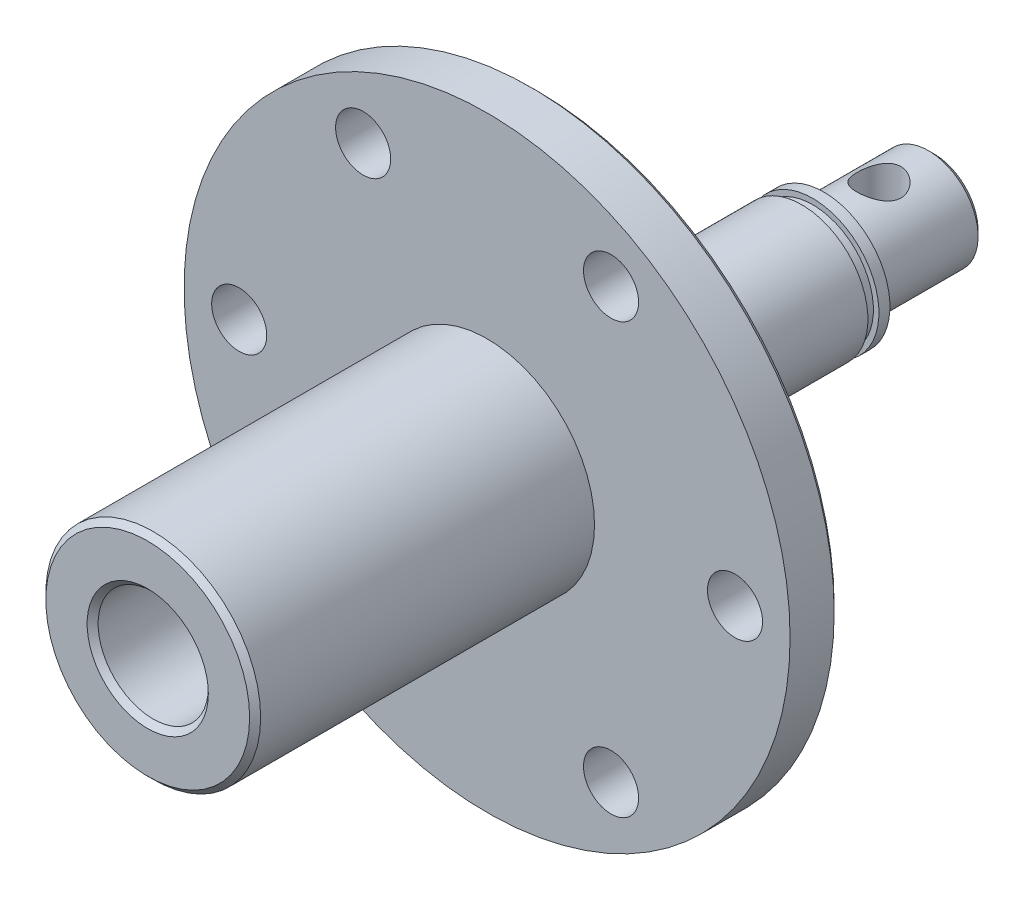
ISO-10303-21;
HEADER;
FILE_DESCRIPTION(('STEP AP214'),'2;1');
FILE_NAME('part.step','',(''),(''),'','','');
FILE_SCHEMA(('AUTOMOTIVE_DESIGN { 1 0 10303 214 1 1 1 1 }'));
ENDSEC;
DATA;
#1=APPLICATION_CONTEXT('core data for automotive mechanical design processes');
#2=APPLICATION_PROTOCOL_DEFINITION('international standard','automotive_design',2000,#1);
#3=PRODUCT_CONTEXT('',#1,'mechanical');
#4=PRODUCT('Part','Part','',(#3));
#5=PRODUCT_RELATED_PRODUCT_CATEGORY('part','',(#4));
#6=PRODUCT_DEFINITION_FORMATION('','',#4);
#7=PRODUCT_DEFINITION_CONTEXT('part definition',#1,'design');
#8=PRODUCT_DEFINITION('design','',#6,#7);
#9=PRODUCT_DEFINITION_SHAPE('','',#8);
#10=(LENGTH_UNIT() NAMED_UNIT(*) SI_UNIT(.MILLI.,.METRE.));
#11=(NAMED_UNIT(*) PLANE_ANGLE_UNIT() SI_UNIT($,.RADIAN.));
#12=(NAMED_UNIT(*) SI_UNIT($,.STERADIAN.) SOLID_ANGLE_UNIT());
#13=UNCERTAINTY_MEASURE_WITH_UNIT(LENGTH_MEASURE(1.E-05),#10,'distance_accuracy_value','');
#14=(GEOMETRIC_REPRESENTATION_CONTEXT(3) GLOBAL_UNCERTAINTY_ASSIGNED_CONTEXT((#13)) GLOBAL_UNIT_ASSIGNED_CONTEXT((#10,
#11,#12)) REPRESENTATION_CONTEXT('',''));
#15=CARTESIAN_POINT('',(0.,0.,0.));
#16=DIRECTION('',(0.,0.,1.));
#17=DIRECTION('',(1.,0.,0.));
#18=AXIS2_PLACEMENT_3D('',#15,#16,#17);
#19=CARTESIAN_POINT('',(0.,0.,3.));
#20=DIRECTION('',(0.,0.,1.));
#21=DIRECTION('',(1.,0.,0.));
#22=AXIS2_PLACEMENT_3D('',#19,#20,#21);
#23=PLANE('',#22);
#24=CARTESIAN_POINT('',(-22.5,0.,3.));
#25=DIRECTION('',(0.,0.,1.));
#26=DIRECTION('',(1.,0.,0.));
#27=AXIS2_PLACEMENT_3D('',#24,#25,#26);
#28=CIRCLE('',#27,2.49999999999998);
#29=CARTESIAN_POINT('',(-20.,0.,3.));
#30=VERTEX_POINT('',#29);
#31=EDGE_CURVE('E612',#30,#30,#28,.T.);
#32=ORIENTED_EDGE('',*,*,#31,.F.);
#33=EDGE_LOOP('',(#32));
#34=FACE_BOUND('',#33,.T.);
#35=CARTESIAN_POINT('',(-11.25,19.48557158515,3.));
#36=DIRECTION('',(0.,0.,1.));
#37=DIRECTION('',(1.,0.,0.));
#38=AXIS2_PLACEMENT_3D('',#35,#36,#37);
#39=CIRCLE('',#38,2.49999999999998);
#40=CARTESIAN_POINT('',(-8.75000000000001,19.48557158515,3.));
#41=VERTEX_POINT('',#40);
#42=EDGE_CURVE('E606',#41,#41,#39,.T.);
#43=ORIENTED_EDGE('',*,*,#42,.F.);
#44=EDGE_LOOP('',(#43));
#45=FACE_BOUND('',#44,.T.);
#46=CARTESIAN_POINT('',(11.25,19.48557158515,3.));
#47=DIRECTION('',(0.,0.,1.));
#48=DIRECTION('',(1.,0.,0.));
#49=AXIS2_PLACEMENT_3D('',#46,#47,#48);
#50=CIRCLE('',#49,2.49999999999998);
#51=CARTESIAN_POINT('',(13.75,19.48557158515,3.));
#52=VERTEX_POINT('',#51);
#53=EDGE_CURVE('E600',#52,#52,#50,.T.);
#54=ORIENTED_EDGE('',*,*,#53,.F.);
#55=EDGE_LOOP('',(#54));
#56=FACE_BOUND('',#55,.T.);
#57=CARTESIAN_POINT('',(22.5,0.,3.));
#58=DIRECTION('',(0.,0.,1.));
#59=DIRECTION('',(1.,0.,0.));
#60=AXIS2_PLACEMENT_3D('',#57,#58,#59);
#61=CIRCLE('',#60,2.49999999999998);
#62=CARTESIAN_POINT('',(25.,0.,3.));
#63=VERTEX_POINT('',#62);
#64=EDGE_CURVE('E594',#63,#63,#61,.T.);
#65=ORIENTED_EDGE('',*,*,#64,.F.);
#66=EDGE_LOOP('',(#65));
#67=FACE_BOUND('',#66,.T.);
#68=CARTESIAN_POINT('',(11.25,-19.48557158515,3.));
#69=DIRECTION('',(0.,0.,1.));
#70=DIRECTION('',(1.,0.,0.));
#71=AXIS2_PLACEMENT_3D('',#68,#69,#70);
#72=CIRCLE('',#71,2.49999999999998);
#73=CARTESIAN_POINT('',(13.75,-19.48557158515,3.));
#74=VERTEX_POINT('',#73);
#75=EDGE_CURVE('E588',#74,#74,#72,.T.);
#76=ORIENTED_EDGE('',*,*,#75,.F.);
#77=EDGE_LOOP('',(#76));
#78=FACE_BOUND('',#77,.T.);
#79=CARTESIAN_POINT('',(-11.25,-19.48557158515,3.));
#80=DIRECTION('',(0.,0.,1.));
#81=DIRECTION('',(1.,0.,0.));
#82=AXIS2_PLACEMENT_3D('',#79,#80,#81);
#83=CIRCLE('',#82,2.49999999999998);
#84=CARTESIAN_POINT('',(-8.75000000000001,-19.48557158515,3.));
#85=VERTEX_POINT('',#84);
#86=EDGE_CURVE('E229',#85,#85,#83,.T.);
#87=ORIENTED_EDGE('',*,*,#86,.F.);
#88=EDGE_LOOP('',(#87));
#89=FACE_BOUND('',#88,.T.);
#90=CARTESIAN_POINT('',(0.,0.,3.));
#91=DIRECTION('',(0.,0.,1.));
#92=DIRECTION('',(1.,0.,0.));
#93=AXIS2_PLACEMENT_3D('',#90,#91,#92);
#94=CIRCLE('',#93,27.5);
#95=CARTESIAN_POINT('',(27.5,0.,3.));
#96=VERTEX_POINT('',#95);
#97=EDGE_CURVE('E85',#96,#96,#94,.T.);
#98=ORIENTED_EDGE('',*,*,#97,.T.);
#99=EDGE_LOOP('',(#98));
#100=FACE_BOUND('',#99,.T.);
#101=CARTESIAN_POINT('',(0.,0.,3.));
#102=DIRECTION('',(0.,0.,1.));
#103=DIRECTION('',(1.,0.,0.));
#104=AXIS2_PLACEMENT_3D('',#101,#102,#103);
#105=CIRCLE('',#104,9.75);
#106=CARTESIAN_POINT('',(9.75,0.,3.));
#107=VERTEX_POINT('',#106);
#108=EDGE_CURVE('E223',#107,#107,#105,.T.);
#109=ORIENTED_EDGE('',*,*,#108,.F.);
#110=EDGE_LOOP('',(#109));
#111=FACE_BOUND('',#110,.T.);
#112=ADVANCED_FACE('F40',(#34,#45,#56,#67,#78,#89,#100,#111),#23,.T.);
#113=CARTESIAN_POINT('',(0.,0.,-27.56));
#114=DIRECTION('',(0.,0.,-1.));
#115=DIRECTION('',(-1.,0.,0.));
#116=AXIS2_PLACEMENT_3D('',#113,#114,#115);
#117=PLANE('',#116);
#118=CARTESIAN_POINT('',(0.,0.,-27.56));
#119=DIRECTION('',(0.,0.,-1.));
#120=DIRECTION('',(-1.,0.,0.));
#121=AXIS2_PLACEMENT_3D('',#118,#119,#120);
#122=CIRCLE('',#121,6.);
#123=CARTESIAN_POINT('',(-6.,0.,-27.56));
#124=VERTEX_POINT('',#123);
#125=EDGE_CURVE('E222',#124,#124,#122,.F.);
#126=ORIENTED_EDGE('',*,*,#125,.F.);
#127=EDGE_LOOP('',(#126));
#128=FACE_BOUND('',#127,.T.);
#129=CARTESIAN_POINT('',(0.,0.,-27.56));
#130=DIRECTION('',(0.,0.,-1.));
#131=DIRECTION('',(-1.,0.,0.));
#132=AXIS2_PLACEMENT_3D('',#129,#130,#131);
#133=CIRCLE('',#132,4.5);
#134=CARTESIAN_POINT('',(-4.5,0.,-27.56));
#135=VERTEX_POINT('',#134);
#136=EDGE_CURVE('E220',#135,#135,#133,.T.);
#137=ORIENTED_EDGE('',*,*,#136,.F.);
#138=EDGE_LOOP('',(#137));
#139=FACE_BOUND('',#138,.T.);
#140=ADVANCED_FACE('F150',(#128,#139),#117,.T.);
#141=CARTESIAN_POINT('',(0.,0.,-26.56));
#142=DIRECTION('',(0.,0.,-1.));
#143=DIRECTION('',(-1.,0.,0.));
#144=AXIS2_PLACEMENT_3D('',#141,#142,#143);
#145=CYLINDRICAL_SURFACE('',#144,6.);
#146=ORIENTED_EDGE('',*,*,#125,.T.);
#147=EDGE_LOOP('',(#146));
#148=FACE_BOUND('',#147,.T.);
#149=CARTESIAN_POINT('',(0.,0.,-26.56));
#150=DIRECTION('',(0.,0.,-1.));
#151=DIRECTION('',(-1.,0.,0.));
#152=AXIS2_PLACEMENT_3D('',#149,#150,#151);
#153=CIRCLE('',#152,6.);
#154=CARTESIAN_POINT('',(-6.,0.,-26.56));
#155=VERTEX_POINT('',#154);
#156=EDGE_CURVE('E227',#155,#155,#153,.T.);
#157=ORIENTED_EDGE('',*,*,#156,.T.);
#158=EDGE_LOOP('',(#157));
#159=FACE_BOUND('',#158,.T.);
#160=ADVANCED_FACE('F148',(#148,#159),#145,.T.);
#161=CARTESIAN_POINT('',(0.,0.,-26.56));
#162=DIRECTION('',(0.,0.,-1.));
#163=DIRECTION('',(-1.,0.,0.));
#164=AXIS2_PLACEMENT_3D('',#161,#162,#163);
#165=PLANE('',#164);
#166=CARTESIAN_POINT('',(0.,0.,-26.56));
#167=DIRECTION('',(0.,0.,-1.));
#168=DIRECTION('',(-1.,0.,0.));
#169=AXIS2_PLACEMENT_3D('',#166,#167,#168);
#170=CIRCLE('',#169,5.5);
#171=CARTESIAN_POINT('',(-5.5,0.,-26.56));
#172=VERTEX_POINT('',#171);
#173=EDGE_CURVE('E261',#172,#172,#170,.F.);
#174=ORIENTED_EDGE('',*,*,#173,.F.);
#175=EDGE_LOOP('',(#174));
#176=FACE_BOUND('',#175,.T.);
#177=ORIENTED_EDGE('',*,*,#156,.F.);
#178=EDGE_LOOP('',(#177));
#179=FACE_BOUND('',#178,.T.);
#180=ADVANCED_FACE('F184',(#176,#179),#165,.F.);
#181=CARTESIAN_POINT('',(0.,0.,-25.56));
#182=DIRECTION('',(0.,0.,-1.));
#183=DIRECTION('',(-1.,0.,0.));
#184=AXIS2_PLACEMENT_3D('',#181,#182,#183);
#185=CYLINDRICAL_SURFACE('',#184,5.5);
#186=CARTESIAN_POINT('',(0.,0.,-25.56));
#187=DIRECTION('',(0.,0.,-1.));
#188=DIRECTION('',(-1.,0.,0.));
#189=AXIS2_PLACEMENT_3D('',#186,#187,#188);
#190=CIRCLE('',#189,5.5);
#191=CARTESIAN_POINT('',(-5.5,0.,-25.56));
#192=VERTEX_POINT('',#191);
#193=EDGE_CURVE('E325',#192,#192,#190,.F.);
#194=ORIENTED_EDGE('',*,*,#193,.F.);
#195=EDGE_LOOP('',(#194));
#196=FACE_BOUND('',#195,.T.);
#197=ORIENTED_EDGE('',*,*,#173,.T.);
#198=EDGE_LOOP('',(#197));
#199=FACE_BOUND('',#198,.T.);
#200=ADVANCED_FACE('F180',(#196,#199),#185,.T.);
#201=CARTESIAN_POINT('',(0.,0.,-25.56));
#202=DIRECTION('',(0.,0.,-1.));
#203=DIRECTION('',(-1.,0.,0.));
#204=AXIS2_PLACEMENT_3D('',#201,#202,#203);
#205=PLANE('',#204);
#206=ORIENTED_EDGE('',*,*,#193,.T.);
#207=EDGE_LOOP('',(#206));
#208=FACE_BOUND('',#207,.T.);
#209=CARTESIAN_POINT('',(0.,0.,-25.56));
#210=DIRECTION('',(0.,0.,-1.));
#211=DIRECTION('',(-1.,0.,0.));
#212=AXIS2_PLACEMENT_3D('',#209,#210,#211);
#213=CIRCLE('',#212,6.);
#214=CARTESIAN_POINT('',(-6.,0.,-25.56));
#215=VERTEX_POINT('',#214);
#216=EDGE_CURVE('E329',#215,#215,#213,.F.);
#217=ORIENTED_EDGE('',*,*,#216,.F.);
#218=EDGE_LOOP('',(#217));
#219=FACE_BOUND('',#218,.T.);
#220=ADVANCED_FACE('F176',(#208,#219),#205,.T.);
#221=CARTESIAN_POINT('',(0.,0.,-14.56));
#222=DIRECTION('',(0.,0.,-1.));
#223=DIRECTION('',(-1.,0.,0.));
#224=AXIS2_PLACEMENT_3D('',#221,#222,#223);
#225=CYLINDRICAL_SURFACE('',#224,6.);
#226=ORIENTED_EDGE('',*,*,#216,.T.);
#227=EDGE_LOOP('',(#226));
#228=FACE_BOUND('',#227,.T.);
#229=CARTESIAN_POINT('',(0.,0.,-14.56));
#230=DIRECTION('',(0.,0.,-1.));
#231=DIRECTION('',(-1.,0.,0.));
#232=AXIS2_PLACEMENT_3D('',#229,#230,#231);
#233=CIRCLE('',#232,6.);
#234=CARTESIAN_POINT('',(-6.,0.,-14.56));
#235=VERTEX_POINT('',#234);
#236=EDGE_CURVE('E332',#235,#235,#233,.F.);
#237=ORIENTED_EDGE('',*,*,#236,.F.);
#238=EDGE_LOOP('',(#237));
#239=FACE_BOUND('',#238,.T.);
#240=ADVANCED_FACE('F172',(#228,#239),#225,.T.);
#241=CARTESIAN_POINT('',(0.,0.,-14.56));
#242=DIRECTION('',(0.,0.,-1.));
#243=DIRECTION('',(-1.,0.,0.));
#244=AXIS2_PLACEMENT_3D('',#241,#242,#243);
#245=PLANE('',#244);
#246=CARTESIAN_POINT('',(0.,0.,-14.56));
#247=DIRECTION('',(0.,0.,-1.));
#248=DIRECTION('',(-1.,0.,0.));
#249=AXIS2_PLACEMENT_3D('',#246,#247,#248);
#250=CIRCLE('',#249,8.49992750991391);
#251=CARTESIAN_POINT('',(-8.49992750991391,0.,-14.56));
#252=VERTEX_POINT('',#251);
#253=EDGE_CURVE('E66',#252,#252,#250,.T.);
#254=ORIENTED_EDGE('',*,*,#253,.T.);
#255=EDGE_LOOP('',(#254));
#256=FACE_BOUND('',#255,.T.);
#257=ORIENTED_EDGE('',*,*,#236,.T.);
#258=EDGE_LOOP('',(#257));
#259=FACE_BOUND('',#258,.T.);
#260=ADVANCED_FACE('F168',(#256,#259),#245,.T.);
#261=CARTESIAN_POINT('',(0.,0.,0.));
#262=DIRECTION('',(0.,0.,-1.));
#263=DIRECTION('',(-1.,0.,0.));
#264=AXIS2_PLACEMENT_3D('',#261,#262,#263);
#265=CYLINDRICAL_SURFACE('',#264,9.);
#266=CARTESIAN_POINT('',(0.,0.,-14.0599232451364));
#267=DIRECTION('',(0.,0.,-1.));
#268=DIRECTION('',(-1.,0.,0.));
#269=AXIS2_PLACEMENT_3D('',#266,#267,#268);
#270=CIRCLE('',#269,9.);
#271=CARTESIAN_POINT('',(-9.,0.,-14.0599232451364));
#272=VERTEX_POINT('',#271);
#273=EDGE_CURVE('E69',#272,#272,#270,.F.);
#274=ORIENTED_EDGE('',*,*,#273,.T.);
#275=EDGE_LOOP('',(#274));
#276=FACE_BOUND('',#275,.T.);
#277=CARTESIAN_POINT('',(0.,0.,-1.5));
#278=DIRECTION('',(0.,0.,-1.));
#279=DIRECTION('',(-1.,0.,0.));
#280=AXIS2_PLACEMENT_3D('',#277,#278,#279);
#281=CIRCLE('',#280,9.);
#282=CARTESIAN_POINT('',(-9.,0.,-1.5));
#283=VERTEX_POINT('',#282);
#284=EDGE_CURVE('E237',#283,#283,#281,.T.);
#285=ORIENTED_EDGE('',*,*,#284,.T.);
#286=EDGE_LOOP('',(#285));
#287=FACE_BOUND('',#286,.T.);
#288=ADVANCED_FACE('F165',(#276,#287),#265,.T.);
#289=CARTESIAN_POINT('',(0.,0.,-1.5));
#290=DIRECTION('',(0.,0.,1.));
#291=DIRECTION('',(1.,0.,0.));
#292=AXIS2_PLACEMENT_3D('',#289,#290,#291);
#293=PLANE('',#292);
#294=CARTESIAN_POINT('',(0.,0.,-1.5));
#295=DIRECTION('',(0.,0.,1.));
#296=DIRECTION('',(1.,0.,0.));
#297=AXIS2_PLACEMENT_3D('',#294,#295,#296);
#298=CIRCLE('',#297,27.0000012770885);
#299=CARTESIAN_POINT('',(27.0000012770885,0.,-1.5));
#300=VERTEX_POINT('',#299);
#301=EDGE_CURVE('E12',#300,#300,#298,.F.);
#302=ORIENTED_EDGE('',*,*,#301,.T.);
#303=EDGE_LOOP('',(#302));
#304=FACE_BOUND('',#303,.T.);
#305=CARTESIAN_POINT('',(-22.5,0.,-1.5));
#306=DIRECTION('',(0.,0.,-1.));
#307=DIRECTION('',(-1.,0.,0.));
#308=AXIS2_PLACEMENT_3D('',#305,#306,#307);
#309=CIRCLE('',#308,2.49999999999999);
#310=CARTESIAN_POINT('',(-25.,0.,-1.5));
#311=VERTEX_POINT('',#310);
#312=EDGE_CURVE('E615',#311,#311,#309,.T.);
#313=ORIENTED_EDGE('',*,*,#312,.F.);
#314=EDGE_LOOP('',(#313));
#315=FACE_BOUND('',#314,.T.);
#316=CARTESIAN_POINT('',(-11.25,19.48557158515,-1.5));
#317=DIRECTION('',(0.,0.,-1.));
#318=DIRECTION('',(-1.,0.,0.));
#319=AXIS2_PLACEMENT_3D('',#316,#317,#318);
#320=CIRCLE('',#319,2.49999999999999);
#321=CARTESIAN_POINT('',(-13.75,19.48557158515,-1.5));
#322=VERTEX_POINT('',#321);
#323=EDGE_CURVE('E609',#322,#322,#320,.T.);
#324=ORIENTED_EDGE('',*,*,#323,.F.);
#325=EDGE_LOOP('',(#324));
#326=FACE_BOUND('',#325,.T.);
#327=CARTESIAN_POINT('',(11.25,19.48557158515,-1.5));
#328=DIRECTION('',(0.,0.,-1.));
#329=DIRECTION('',(-1.,0.,0.));
#330=AXIS2_PLACEMENT_3D('',#327,#328,#329);
#331=CIRCLE('',#330,2.49999999999999);
#332=CARTESIAN_POINT('',(8.75000000000001,19.48557158515,-1.5));
#333=VERTEX_POINT('',#332);
#334=EDGE_CURVE('E603',#333,#333,#331,.T.);
#335=ORIENTED_EDGE('',*,*,#334,.F.);
#336=EDGE_LOOP('',(#335));
#337=FACE_BOUND('',#336,.T.);
#338=CARTESIAN_POINT('',(22.5,0.,-1.5));
#339=DIRECTION('',(0.,0.,-1.));
#340=DIRECTION('',(-1.,0.,0.));
#341=AXIS2_PLACEMENT_3D('',#338,#339,#340);
#342=CIRCLE('',#341,2.49999999999999);
#343=CARTESIAN_POINT('',(20.,0.,-1.5));
#344=VERTEX_POINT('',#343);
#345=EDGE_CURVE('E597',#344,#344,#342,.T.);
#346=ORIENTED_EDGE('',*,*,#345,.F.);
#347=EDGE_LOOP('',(#346));
#348=FACE_BOUND('',#347,.T.);
#349=CARTESIAN_POINT('',(11.25,-19.48557158515,-1.5));
#350=DIRECTION('',(0.,0.,-1.));
#351=DIRECTION('',(-1.,0.,0.));
#352=AXIS2_PLACEMENT_3D('',#349,#350,#351);
#353=CIRCLE('',#352,2.49999999999999);
#354=CARTESIAN_POINT('',(8.75000000000001,-19.48557158515,-1.5));
#355=VERTEX_POINT('',#354);
#356=EDGE_CURVE('E591',#355,#355,#353,.T.);
#357=ORIENTED_EDGE('',*,*,#356,.F.);
#358=EDGE_LOOP('',(#357));
#359=FACE_BOUND('',#358,.T.);
#360=CARTESIAN_POINT('',(-11.25,-19.48557158515,-1.5));
#361=DIRECTION('',(0.,0.,-1.));
#362=DIRECTION('',(-1.,0.,0.));
#363=AXIS2_PLACEMENT_3D('',#360,#361,#362);
#364=CIRCLE('',#363,2.49999999999999);
#365=CARTESIAN_POINT('',(-13.75,-19.48557158515,-1.5));
#366=VERTEX_POINT('',#365);
#367=EDGE_CURVE('E585',#366,#366,#364,.T.);
#368=ORIENTED_EDGE('',*,*,#367,.F.);
#369=EDGE_LOOP('',(#368));
#370=FACE_BOUND('',#369,.T.);
#371=ORIENTED_EDGE('',*,*,#284,.F.);
#372=EDGE_LOOP('',(#371));
#373=FACE_BOUND('',#372,.T.);
#374=ADVANCED_FACE('F162',(#304,#315,#326,#337,#348,#359,#370,#373),#293,.F.);
#375=CARTESIAN_POINT('',(0.,0.,0.));
#376=DIRECTION('',(0.,0.,1.));
#377=DIRECTION('',(1.,0.,0.));
#378=AXIS2_PLACEMENT_3D('',#375,#376,#377);
#379=CYLINDRICAL_SURFACE('',#378,27.5);
#380=CARTESIAN_POINT('',(0.,0.,-1.00000133265843));
#381=DIRECTION('',(0.,0.,1.));
#382=DIRECTION('',(1.,0.,0.));
#383=AXIS2_PLACEMENT_3D('',#380,#381,#382);
#384=CIRCLE('',#383,27.5);
#385=CARTESIAN_POINT('',(27.5,0.,-1.00000133265843));
#386=VERTEX_POINT('',#385);
#387=EDGE_CURVE('E47',#386,#386,#384,.T.);
#388=ORIENTED_EDGE('',*,*,#387,.T.);
#389=EDGE_LOOP('',(#388));
#390=FACE_BOUND('',#389,.T.);
#391=ORIENTED_EDGE('',*,*,#97,.F.);
#392=EDGE_LOOP('',(#391));
#393=FACE_BOUND('',#392,.T.);
#394=ADVANCED_FACE('F146',(#390,#393),#379,.T.);
#395=CARTESIAN_POINT('',(0.,0.,-37.56));
#396=DIRECTION('',(0.,0.,1.));
#397=DIRECTION('',(1.,0.,0.));
#398=AXIS2_PLACEMENT_3D('',#395,#396,#397);
#399=CYLINDRICAL_SURFACE('',#398,4.5);
#400=CARTESIAN_POINT('',(0.,0.,-37.0599004636022));
#401=DIRECTION('',(0.,0.,-1.));
#402=DIRECTION('',(-1.,0.,0.));
#403=AXIS2_PLACEMENT_3D('',#400,#401,#402);
#404=CIRCLE('',#403,4.5);
#405=CARTESIAN_POINT('',(-4.5,0.,-37.0599004636022));
#406=VERTEX_POINT('',#405);
#407=EDGE_CURVE('E51',#406,#406,#404,.F.);
#408=ORIENTED_EDGE('',*,*,#407,.T.);
#409=EDGE_LOOP('',(#408));
#410=FACE_BOUND('',#409,.T.);
#411=CARTESIAN_POINT('',(0.,4.5,-30.56));
#412=CARTESIAN_POINT('',(-0.106491721841543,4.49999592201235,-30.5600049824188));
#413=CARTESIAN_POINT('',(-0.213149908398589,4.49617759862479,-30.5685554450453));
#414=CARTESIAN_POINT('',(-0.423397791553029,4.48128347117207,-30.6024184448918));
#415=CARTESIAN_POINT('',(-0.526979488674807,4.4701902292036,-30.6277712587208));
#416=CARTESIAN_POINT('',(-0.727700457039994,4.44192390608474,-30.6941004654991));
#417=CARTESIAN_POINT('',(-0.824861278500739,4.4247725319732,-30.7350211167861));
#418=CARTESIAN_POINT('',(-1.01083182992512,4.38602940690416,-30.8310752819471));
#419=CARTESIAN_POINT('',(-1.09964345718941,4.36443866833523,-30.8862055560692));
#420=CARTESIAN_POINT('',(-1.27147987858136,4.31759990391249,-31.0123348400788));
#421=CARTESIAN_POINT('',(-1.35398160775403,4.29222181537652,-31.0839976430955));
#422=CARTESIAN_POINT('',(-1.50625667860228,4.24118529786287,-31.2397482632871));
#423=CARTESIAN_POINT('',(-1.57602243299505,4.21552671136583,-31.3238434332406));
#424=CARTESIAN_POINT('',(-1.70484606406971,4.16516047349691,-31.5079387219984));
#425=CARTESIAN_POINT('',(-1.76305311381033,4.14059326444591,-31.6085768143158));
#426=CARTESIAN_POINT('',(-1.86148058259833,4.09729211094913,-31.8194552469065));
#427=CARTESIAN_POINT('',(-1.90171150191226,4.07855476309652,-31.9296899365047));
#428=CARTESIAN_POINT('',(-1.9608115239539,4.05046224857977,-32.1506203804208));
#429=CARTESIAN_POINT('',(-1.9806931696717,4.04066532542944,-32.2609867344019));
#430=CARTESIAN_POINT('',(-2.0016782831302,4.03031463933106,-32.4838897701647));
#431=CARTESIAN_POINT('',(-2.00279429210703,4.02975470323002,-32.5964249521423));
#432=CARTESIAN_POINT('',(-1.98697164299088,4.03757276711961,-32.8096954486293));
#433=CARTESIAN_POINT('',(-1.97164003901052,4.04515525710507,-32.9105853691699));
#434=CARTESIAN_POINT('',(-1.92608101262573,4.06704362044732,-33.1081752249563));
#435=CARTESIAN_POINT('',(-1.89585024271052,4.08135100470465,-33.2048742132787));
#436=CARTESIAN_POINT('',(-1.8207520712529,4.11540857141478,-33.3939336277319));
#437=CARTESIAN_POINT('',(-1.77557135736334,4.13527371795059,-33.4861479451409));
#438=CARTESIAN_POINT('',(-1.67208117489406,4.17819078324411,-33.6620759144744));
#439=CARTESIAN_POINT('',(-1.61376617867146,4.20124404215705,-33.7457859657406));
#440=CARTESIAN_POINT('',(-1.47900808503926,4.25066638916312,-33.9109136014771));
#441=CARTESIAN_POINT('',(-1.40135242758351,4.2771397203327,-33.9913134784174));
#442=CARTESIAN_POINT('',(-1.23343821212404,4.32854899612319,-34.1383174435574));
#443=CARTESIAN_POINT('',(-1.14317585772421,4.3534844743602,-34.2049173609599));
#444=CARTESIAN_POINT('',(-0.949152758511847,4.39992448973313,-34.324213227722));
#445=CARTESIAN_POINT('',(-0.845072037598952,4.42130591930767,-34.3764403431934));
#446=CARTESIAN_POINT('',(-0.62840742286646,4.45725580673344,-34.4622769499122));
#447=CARTESIAN_POINT('',(-0.51582894070805,4.47182855876463,-34.495898178223));
#448=CARTESIAN_POINT('',(-0.293820535494523,4.4916825843904,-34.541311882686));
#449=CARTESIAN_POINT('',(-0.184721163041692,4.49754246102964,-34.554466697251));
#450=CARTESIAN_POINT('',(0.0342770387909848,4.5012000386526,-34.5627031230688));
#451=CARTESIAN_POINT('',(0.144175583963885,4.49900047806664,-34.557790873135));
#452=CARTESIAN_POINT('',(0.354907416738488,4.48715295545649,-34.5309564273192));
#453=CARTESIAN_POINT('',(0.455896417732648,4.47794517757649,-34.5100391074805));
#454=CARTESIAN_POINT('',(0.65279207295849,4.45350542314086,-34.4532420208969));
#455=CARTESIAN_POINT('',(0.748698107925824,4.43827271446453,-34.4173604357375));
#456=CARTESIAN_POINT('',(0.936104051933312,4.40262377340665,-34.3305111175896));
#457=CARTESIAN_POINT('',(1.02737315333644,4.38206065228313,-34.2791076528856));
#458=CARTESIAN_POINT('',(1.20031927875007,4.33788123051325,-34.1631485739821));
#459=CARTESIAN_POINT('',(1.28199210078392,4.31426360181097,-34.0985872318545));
#460=CARTESIAN_POINT('',(1.44036721253597,4.26412793153244,-33.9520832202014));
#461=CARTESIAN_POINT('',(1.51613838739789,4.23752954099254,-33.8691590625199));
#462=CARTESIAN_POINT('',(1.65300242266303,4.18604134951668,-33.6914446596841));
#463=CARTESIAN_POINT('',(1.71409007929175,4.16115215653839,-33.5966502258046));
#464=CARTESIAN_POINT('',(1.82107573137389,4.11547790156447,-33.3948756921922));
#465=CARTESIAN_POINT('',(1.86658327729172,4.09480296069983,-33.2876616836367));
#466=CARTESIAN_POINT('',(1.93846492016289,4.0612750280089,-33.0658731846905));
#467=CARTESIAN_POINT('',(1.96485774363288,4.04841438258478,-32.9513060182693));
#468=CARTESIAN_POINT('',(1.99578547827109,4.03325053556433,-32.7285184238222));
#469=CARTESIAN_POINT('',(2.00198344684387,4.03014488230275,-32.6205831214728));
#470=CARTESIAN_POINT('',(1.9969077486471,4.03266289201163,-32.4052403967985));
#471=CARTESIAN_POINT('',(1.98563780742458,4.03828469359532,-32.2978328668117));
#472=CARTESIAN_POINT('',(1.94740226605597,4.056849647764,-32.0933080727342));
#473=CARTESIAN_POINT('',(1.9214217222081,4.06933199333215,-31.9959604809543));
#474=CARTESIAN_POINT('',(1.85554194393924,4.0997894687622,-31.8070180809608));
#475=CARTESIAN_POINT('',(1.81563868559954,4.11776618641146,-31.715424944931));
#476=CARTESIAN_POINT('',(1.72012109921672,4.15861055539883,-31.5341623917112));
#477=CARTESIAN_POINT('',(1.66366385858235,4.18171780090032,-31.4449923502232));
#478=CARTESIAN_POINT('',(1.53773594407696,4.22964589951756,-31.2768751866533));
#479=CARTESIAN_POINT('',(1.46825983476649,4.25446746562724,-31.1979323578496));
#480=CARTESIAN_POINT('',(1.31108140365531,4.30563232874032,-31.0453775868018));
#481=CARTESIAN_POINT('',(1.22231636253248,4.33191880579014,-30.9728360369635));
#482=CARTESIAN_POINT('',(1.03295134905357,4.38093190708685,-30.843564782972));
#483=CARTESIAN_POINT('',(0.932345999936706,4.40365690303547,-30.7868423020641));
#484=CARTESIAN_POINT('',(0.723051823292358,4.44279207455561,-30.6917761373436));
#485=CARTESIAN_POINT('',(0.61446726176611,4.45927074863037,-30.6532318899168));
#486=CARTESIAN_POINT('',(0.391615018990356,4.48431907433046,-30.5953602495232));
#487=CARTESIAN_POINT('',(0.277365804280783,4.49291284638178,-30.5759742361537));
#488=CARTESIAN_POINT('',(0.135356670708521,4.4980461865859,-30.5644002736526));
#489=CARTESIAN_POINT('',(0.108319935768281,4.49877760770441,-30.5627517114133));
#490=CARTESIAN_POINT('',(0.0541923948081816,4.49975503614401,-30.5605509342197));
#491=CARTESIAN_POINT('',(0.027101588163901,4.5000010378266,-30.5599987320004));
#492=CARTESIAN_POINT('',(0.,4.5,-30.56));
#493=B_SPLINE_CURVE_WITH_KNOTS('',3,(#411,#412,#413,#414,#415,#416,#417,#418,#419,#420,#421,
#422,#423,#424,#425,#426,#427,#428,#429,#430,#431,#432,#433,#434,#435,#436,#437,#438,#439,#440,
#441,#442,#443,#444,#445,#446,#447,#448,#449,#450,#451,#452,#453,#454,#455,#456,#457,#458,#459,
#460,#461,#462,#463,#464,#465,#466,#467,#468,#469,#470,#471,#472,#473,#474,#475,#476,#477,#478,
#479,#480,#481,#482,#483,#484,#485,#486,#487,#488,#489,#490,#491,#492),.UNSPECIFIED.,.T.,.F.,(4,
2,2,2,2,2,2,2,2,2,2,2,2,2,2,2,2,2,2,2,2,2,2,2,2,2,2,2,2,2,2,2,2,2,2,2,2,2,2,2,4),(0.,
0.319363757820219,0.639495839039846,0.958492293098599,1.27741608114944,1.61253910860027,
1.94786113409909,2.3025439654081,2.65701934670051,2.99284475492682,3.32844571922347,
3.63400850030663,3.93963996586077,4.25213185320655,4.56475550123119,4.9078334674984,
5.2510149723417,5.60433395902647,5.95742980836629,6.28582812976757,6.61411487855045,
6.92332786204151,7.2325784311607,7.55147695543656,7.87051460127427,8.21526516668655,
8.56013773064317,8.91311015646704,9.26573630896647,9.58847399859328,9.91114286435873,
10.214399649514,10.5177441541183,10.8405269704427,11.1634448516016,11.5146101835414,
11.8659356017472,12.2132884514088,12.5595751486183,12.6408506163642,12.7221270281758),.UNSPECIFIED.);
#494=CARTESIAN_POINT('',(0.,4.5,-30.56));
#495=VERTEX_POINT('',#494);
#496=EDGE_CURVE('E78',#495,#495,#493,.T.);
#497=ORIENTED_EDGE('',*,*,#496,.T.);
#498=EDGE_LOOP('',(#497));
#499=FACE_BOUND('',#498,.T.);
#500=CARTESIAN_POINT('',(0.,-4.5,-30.56));
#501=CARTESIAN_POINT('',(0.106491721841543,-4.49999592201235,-30.5600049824188));
#502=CARTESIAN_POINT('',(0.213149908398589,-4.49617759862479,-30.5685554450453));
#503=CARTESIAN_POINT('',(0.423397791553029,-4.48128347117207,-30.6024184448918));
#504=CARTESIAN_POINT('',(0.526979488674807,-4.4701902292036,-30.6277712587208));
#505=CARTESIAN_POINT('',(0.727700457039994,-4.44192390608473,-30.6941004654991));
#506=CARTESIAN_POINT('',(0.824861278500739,-4.4247725319732,-30.7350211167861));
#507=CARTESIAN_POINT('',(1.01083182992512,-4.38602940690416,-30.8310752819471));
#508=CARTESIAN_POINT('',(1.09964345718941,-4.36443866833523,-30.8862055560692));
#509=CARTESIAN_POINT('',(1.27147987858136,-4.31759990391249,-31.0123348400788));
#510=CARTESIAN_POINT('',(1.35398160775403,-4.29222181537652,-31.0839976430955));
#511=CARTESIAN_POINT('',(1.50625667860228,-4.24118529786287,-31.2397482632871));
#512=CARTESIAN_POINT('',(1.57602243299505,-4.21552671136583,-31.3238434332406));
#513=CARTESIAN_POINT('',(1.70484606406971,-4.16516047349691,-31.5079387219984));
#514=CARTESIAN_POINT('',(1.76305311381033,-4.14059326444591,-31.6085768143158));
#515=CARTESIAN_POINT('',(1.86148058259833,-4.09729211094913,-31.8194552469065));
#516=CARTESIAN_POINT('',(1.90171150191226,-4.07855476309652,-31.9296899365047));
#517=CARTESIAN_POINT('',(1.9608115239539,-4.05046224857977,-32.1506203804208));
#518=CARTESIAN_POINT('',(1.9806931696717,-4.04066532542944,-32.2609867344019));
#519=CARTESIAN_POINT('',(2.0016782831302,-4.03031463933106,-32.4838897701647));
#520=CARTESIAN_POINT('',(2.00279429210703,-4.02975470323002,-32.5964249521423));
#521=CARTESIAN_POINT('',(1.98697164299088,-4.03757276711961,-32.8096954486293));
#522=CARTESIAN_POINT('',(1.97164003901052,-4.04515525710507,-32.9105853691699));
#523=CARTESIAN_POINT('',(1.92608101262573,-4.06704362044732,-33.1081752249563));
#524=CARTESIAN_POINT('',(1.89585024271052,-4.08135100470465,-33.2048742132787));
#525=CARTESIAN_POINT('',(1.8207520712529,-4.11540857141478,-33.3939336277319));
#526=CARTESIAN_POINT('',(1.77557135736334,-4.13527371795059,-33.4861479451409));
#527=CARTESIAN_POINT('',(1.67208117489406,-4.17819078324411,-33.6620759144744));
#528=CARTESIAN_POINT('',(1.61376617867146,-4.20124404215705,-33.7457859657406));
#529=CARTESIAN_POINT('',(1.47900808503926,-4.25066638916312,-33.9109136014771));
#530=CARTESIAN_POINT('',(1.40135242758351,-4.2771397203327,-33.9913134784174));
#531=CARTESIAN_POINT('',(1.23343821212404,-4.32854899612319,-34.1383174435574));
#532=CARTESIAN_POINT('',(1.14317585772421,-4.3534844743602,-34.2049173609599));
#533=CARTESIAN_POINT('',(0.949152758511847,-4.39992448973313,-34.324213227722));
#534=CARTESIAN_POINT('',(0.845072037598952,-4.42130591930767,-34.3764403431934));
#535=CARTESIAN_POINT('',(0.62840742286646,-4.45725580673344,-34.4622769499122));
#536=CARTESIAN_POINT('',(0.51582894070805,-4.47182855876463,-34.495898178223));
#537=CARTESIAN_POINT('',(0.293820535494523,-4.4916825843904,-34.541311882686));
#538=CARTESIAN_POINT('',(0.184721163041692,-4.49754246102964,-34.554466697251));
#539=CARTESIAN_POINT('',(-0.0342770387909848,-4.5012000386526,-34.5627031230688));
#540=CARTESIAN_POINT('',(-0.144175583963885,-4.49900047806664,-34.557790873135));
#541=CARTESIAN_POINT('',(-0.354907416738488,-4.48715295545649,-34.5309564273192));
#542=CARTESIAN_POINT('',(-0.455896417732648,-4.47794517757649,-34.5100391074805));
#543=CARTESIAN_POINT('',(-0.65279207295849,-4.45350542314086,-34.4532420208969));
#544=CARTESIAN_POINT('',(-0.748698107925824,-4.43827271446453,-34.4173604357375));
#545=CARTESIAN_POINT('',(-0.936104051933312,-4.40262377340665,-34.3305111175896));
#546=CARTESIAN_POINT('',(-1.02737315333644,-4.38206065228313,-34.2791076528856));
#547=CARTESIAN_POINT('',(-1.20031927875007,-4.33788123051325,-34.1631485739821));
#548=CARTESIAN_POINT('',(-1.28199210078392,-4.31426360181097,-34.0985872318545));
#549=CARTESIAN_POINT('',(-1.44036721253597,-4.26412793153244,-33.9520832202014));
#550=CARTESIAN_POINT('',(-1.51613838739789,-4.23752954099254,-33.8691590625199));
#551=CARTESIAN_POINT('',(-1.65300242266303,-4.18604134951668,-33.6914446596841));
#552=CARTESIAN_POINT('',(-1.71409007929175,-4.16115215653839,-33.5966502258046));
#553=CARTESIAN_POINT('',(-1.82107573137389,-4.11547790156447,-33.3948756921922));
#554=CARTESIAN_POINT('',(-1.86658327729172,-4.09480296069983,-33.2876616836367));
#555=CARTESIAN_POINT('',(-1.93846492016289,-4.0612750280089,-33.0658731846905));
#556=CARTESIAN_POINT('',(-1.96485774363288,-4.04841438258478,-32.9513060182693));
#557=CARTESIAN_POINT('',(-1.99578547827109,-4.03325053556433,-32.7285184238222));
#558=CARTESIAN_POINT('',(-2.00198344684387,-4.03014488230275,-32.6205831214728));
#559=CARTESIAN_POINT('',(-1.9969077486471,-4.03266289201163,-32.4052403967985));
#560=CARTESIAN_POINT('',(-1.98563780742458,-4.03828469359532,-32.2978328668117));
#561=CARTESIAN_POINT('',(-1.94740226605597,-4.056849647764,-32.0933080727342));
#562=CARTESIAN_POINT('',(-1.9214217222081,-4.06933199333215,-31.9959604809543));
#563=CARTESIAN_POINT('',(-1.85554194393924,-4.0997894687622,-31.8070180809608));
#564=CARTESIAN_POINT('',(-1.81563868559954,-4.11776618641146,-31.715424944931));
#565=CARTESIAN_POINT('',(-1.72012109921672,-4.15861055539883,-31.5341623917112));
#566=CARTESIAN_POINT('',(-1.66366385858235,-4.18171780090032,-31.4449923502232));
#567=CARTESIAN_POINT('',(-1.53773594407696,-4.22964589951756,-31.2768751866533));
#568=CARTESIAN_POINT('',(-1.46825983476649,-4.25446746562724,-31.1979323578496));
#569=CARTESIAN_POINT('',(-1.31108140365531,-4.30563232874032,-31.0453775868018));
#570=CARTESIAN_POINT('',(-1.22231636253248,-4.33191880579014,-30.9728360369635));
#571=CARTESIAN_POINT('',(-1.03295134905357,-4.38093190708685,-30.843564782972));
#572=CARTESIAN_POINT('',(-0.932345999936706,-4.40365690303547,-30.7868423020641));
#573=CARTESIAN_POINT('',(-0.723051823292358,-4.44279207455561,-30.6917761373436));
#574=CARTESIAN_POINT('',(-0.61446726176611,-4.45927074863037,-30.6532318899168));
#575=CARTESIAN_POINT('',(-0.391615018990356,-4.48431907433046,-30.5953602495232));
#576=CARTESIAN_POINT('',(-0.277365804280783,-4.49291284638178,-30.5759742361537));
#577=CARTESIAN_POINT('',(-0.135356670708521,-4.4980461865859,-30.5644002736526));
#578=CARTESIAN_POINT('',(-0.108319935768281,-4.49877760770442,-30.5627517114133));
#579=CARTESIAN_POINT('',(-0.0541923948081816,-4.49975503614401,-30.5605509342197));
#580=CARTESIAN_POINT('',(-0.027101588163901,-4.5000010378266,-30.5599987320004));
#581=CARTESIAN_POINT('',(0.,-4.5,-30.56));
#582=B_SPLINE_CURVE_WITH_KNOTS('',3,(#500,#501,#502,#503,#504,#505,#506,#507,#508,#509,#510,
#511,#512,#513,#514,#515,#516,#517,#518,#519,#520,#521,#522,#523,#524,#525,#526,#527,#528,#529,
#530,#531,#532,#533,#534,#535,#536,#537,#538,#539,#540,#541,#542,#543,#544,#545,#546,#547,#548,
#549,#550,#551,#552,#553,#554,#555,#556,#557,#558,#559,#560,#561,#562,#563,#564,#565,#566,#567,
#568,#569,#570,#571,#572,#573,#574,#575,#576,#577,#578,#579,#580,#581),.UNSPECIFIED.,.T.,.F.,(4,
2,2,2,2,2,2,2,2,2,2,2,2,2,2,2,2,2,2,2,2,2,2,2,2,2,2,2,2,2,2,2,2,2,2,2,2,2,2,2,4),(0.,
0.31936375782022,0.639495839039846,0.958492293098599,1.27741608114944,1.61253910860027,
1.94786113409909,2.3025439654081,2.65701934670051,2.99284475492682,3.32844571922347,
3.63400850030663,3.93963996586077,4.25213185320655,4.56475550123119,4.9078334674984,
5.2510149723417,5.60433395902647,5.95742980836629,6.28582812976757,6.61411487855045,
6.92332786204151,7.2325784311607,7.55147695543656,7.87051460127427,8.21526516668655,
8.56013773064317,8.91311015646704,9.26573630896647,9.58847399859328,9.91114286435873,
10.214399649514,10.5177441541183,10.8405269704427,11.1634448516016,11.5146101835414,
11.8659356017472,12.2132884514088,12.5595751486183,12.6408506163642,12.7221270281758),.UNSPECIFIED.);
#583=CARTESIAN_POINT('',(0.,-4.5,-30.56));
#584=VERTEX_POINT('',#583);
#585=EDGE_CURVE('E86',#584,#584,#582,.T.);
#586=ORIENTED_EDGE('',*,*,#585,.T.);
#587=EDGE_LOOP('',(#586));
#588=FACE_BOUND('',#587,.T.);
#589=ORIENTED_EDGE('',*,*,#136,.T.);
#590=EDGE_LOOP('',(#589));
#591=FACE_BOUND('',#590,.T.);
#592=ADVANCED_FACE('F90',(#410,#499,#588,#591),#399,.T.);
#593=CARTESIAN_POINT('',(0.,0.,-37.56));
#594=DIRECTION('',(0.,0.,-1.));
#595=DIRECTION('',(-1.,0.,0.));
#596=AXIS2_PLACEMENT_3D('',#593,#594,#595);
#597=PLANE('',#596);
#598=CARTESIAN_POINT('',(0.,0.,-37.56));
#599=DIRECTION('',(0.,0.,-1.));
#600=DIRECTION('',(-1.,0.,0.));
#601=AXIS2_PLACEMENT_3D('',#598,#599,#600);
#602=CIRCLE('',#601,3.99991152521526);
#603=CARTESIAN_POINT('',(-3.99991152521526,0.,-37.56));
#604=VERTEX_POINT('',#603);
#605=EDGE_CURVE('E55',#604,#604,#602,.T.);
#606=ORIENTED_EDGE('',*,*,#605,.T.);
#607=EDGE_LOOP('',(#606));
#608=FACE_BOUND('',#607,.T.);
#609=ADVANCED_FACE('F139',(#608),#597,.T.);
#610=CARTESIAN_POINT('',(0.,0.,33.8));
#611=DIRECTION('',(0.,0.,-1.));
#612=DIRECTION('',(-1.,0.,0.));
#613=AXIS2_PLACEMENT_3D('',#610,#611,#612);
#614=CYLINDRICAL_SURFACE('',#613,9.75);
#615=CARTESIAN_POINT('',(0.,0.,33.2999199145999));
#616=DIRECTION('',(0.,0.,1.));
#617=DIRECTION('',(1.,0.,0.));
#618=AXIS2_PLACEMENT_3D('',#615,#616,#617);
#619=CIRCLE('',#618,9.75);
#620=CARTESIAN_POINT('',(9.75,0.,33.2999199145999));
#621=VERTEX_POINT('',#620);
#622=EDGE_CURVE('E60',#621,#621,#619,.F.);
#623=ORIENTED_EDGE('',*,*,#622,.T.);
#624=EDGE_LOOP('',(#623));
#625=FACE_BOUND('',#624,.T.);
#626=ORIENTED_EDGE('',*,*,#108,.T.);
#627=EDGE_LOOP('',(#626));
#628=FACE_BOUND('',#627,.T.);
#629=ADVANCED_FACE('F136',(#625,#628),#614,.T.);
#630=CARTESIAN_POINT('',(0.,0.,33.8));
#631=DIRECTION('',(0.,0.,1.));
#632=DIRECTION('',(1.,0.,0.));
#633=AXIS2_PLACEMENT_3D('',#630,#631,#632);
#634=PLANE('',#633);
#635=CARTESIAN_POINT('',(0.,0.,33.8));
#636=DIRECTION('',(0.,0.,1.));
#637=DIRECTION('',(1.,0.,0.));
#638=AXIS2_PLACEMENT_3D('',#635,#636,#637);
#639=CIRCLE('',#638,9.24992402216797);
#640=CARTESIAN_POINT('',(9.24992402216797,0.,33.8));
#641=VERTEX_POINT('',#640);
#642=EDGE_CURVE('E63',#641,#641,#639,.T.);
#643=ORIENTED_EDGE('',*,*,#642,.T.);
#644=EDGE_LOOP('',(#643));
#645=FACE_BOUND('',#644,.T.);
#646=CARTESIAN_POINT('',(0.,0.,33.8));
#647=DIRECTION('',(0.,0.,1.));
#648=DIRECTION('',(1.,0.,0.));
#649=AXIS2_PLACEMENT_3D('',#646,#647,#648);
#650=CIRCLE('',#649,5.49984872399253);
#651=CARTESIAN_POINT('',(5.49984872399253,0.,33.8));
#652=VERTEX_POINT('',#651);
#653=EDGE_CURVE('E72',#652,#652,#650,.F.);
#654=ORIENTED_EDGE('',*,*,#653,.T.);
#655=EDGE_LOOP('',(#654));
#656=FACE_BOUND('',#655,.T.);
#657=ADVANCED_FACE('F132',(#645,#656),#634,.T.);
#658=CARTESIAN_POINT('',(-11.25,-19.48557158515,-1.5));
#659=DIRECTION('',(0.,0.,-1.));
#660=DIRECTION('',(-1.,0.,0.));
#661=AXIS2_PLACEMENT_3D('',#658,#659,#660);
#662=CYLINDRICAL_SURFACE('',#661,2.49999999999998);
#663=ORIENTED_EDGE('',*,*,#86,.T.);
#664=EDGE_LOOP('',(#663));
#665=FACE_BOUND('',#664,.T.);
#666=ORIENTED_EDGE('',*,*,#367,.T.);
#667=EDGE_LOOP('',(#666));
#668=FACE_BOUND('',#667,.T.);
#669=ADVANCED_FACE('F128',(#665,#668),#662,.F.);
#670=CARTESIAN_POINT('',(11.25,-19.48557158515,-1.5));
#671=DIRECTION('',(0.,0.,-1.));
#672=DIRECTION('',(-1.,0.,0.));
#673=AXIS2_PLACEMENT_3D('',#670,#671,#672);
#674=CYLINDRICAL_SURFACE('',#673,2.49999999999998);
#675=ORIENTED_EDGE('',*,*,#75,.T.);
#676=EDGE_LOOP('',(#675));
#677=FACE_BOUND('',#676,.T.);
#678=ORIENTED_EDGE('',*,*,#356,.T.);
#679=EDGE_LOOP('',(#678));
#680=FACE_BOUND('',#679,.T.);
#681=ADVANCED_FACE('F124',(#677,#680),#674,.F.);
#682=CARTESIAN_POINT('',(22.5,0.,-1.5));
#683=DIRECTION('',(0.,0.,-1.));
#684=DIRECTION('',(-1.,0.,0.));
#685=AXIS2_PLACEMENT_3D('',#682,#683,#684);
#686=CYLINDRICAL_SURFACE('',#685,2.49999999999998);
#687=ORIENTED_EDGE('',*,*,#64,.T.);
#688=EDGE_LOOP('',(#687));
#689=FACE_BOUND('',#688,.T.);
#690=ORIENTED_EDGE('',*,*,#345,.T.);
#691=EDGE_LOOP('',(#690));
#692=FACE_BOUND('',#691,.T.);
#693=ADVANCED_FACE('F120',(#689,#692),#686,.F.);
#694=CARTESIAN_POINT('',(11.25,19.48557158515,-1.5));
#695=DIRECTION('',(0.,0.,-1.));
#696=DIRECTION('',(-1.,0.,0.));
#697=AXIS2_PLACEMENT_3D('',#694,#695,#696);
#698=CYLINDRICAL_SURFACE('',#697,2.49999999999998);
#699=ORIENTED_EDGE('',*,*,#53,.T.);
#700=EDGE_LOOP('',(#699));
#701=FACE_BOUND('',#700,.T.);
#702=ORIENTED_EDGE('',*,*,#334,.T.);
#703=EDGE_LOOP('',(#702));
#704=FACE_BOUND('',#703,.T.);
#705=ADVANCED_FACE('F116',(#701,#704),#698,.F.);
#706=CARTESIAN_POINT('',(-11.25,19.48557158515,-1.5));
#707=DIRECTION('',(0.,0.,-1.));
#708=DIRECTION('',(-1.,0.,0.));
#709=AXIS2_PLACEMENT_3D('',#706,#707,#708);
#710=CYLINDRICAL_SURFACE('',#709,2.49999999999998);
#711=ORIENTED_EDGE('',*,*,#42,.T.);
#712=EDGE_LOOP('',(#711));
#713=FACE_BOUND('',#712,.T.);
#714=ORIENTED_EDGE('',*,*,#323,.T.);
#715=EDGE_LOOP('',(#714));
#716=FACE_BOUND('',#715,.T.);
#717=ADVANCED_FACE('F112',(#713,#716),#710,.F.);
#718=CARTESIAN_POINT('',(-22.5,0.,-1.5));
#719=DIRECTION('',(0.,0.,-1.));
#720=DIRECTION('',(-1.,0.,0.));
#721=AXIS2_PLACEMENT_3D('',#718,#719,#720);
#722=CYLINDRICAL_SURFACE('',#721,2.49999999999998);
#723=ORIENTED_EDGE('',*,*,#31,.T.);
#724=EDGE_LOOP('',(#723));
#725=FACE_BOUND('',#724,.T.);
#726=ORIENTED_EDGE('',*,*,#312,.T.);
#727=EDGE_LOOP('',(#726));
#728=FACE_BOUND('',#727,.T.);
#729=ADVANCED_FACE('F108',(#725,#728),#722,.F.);
#730=CARTESIAN_POINT('',(0.,0.,5.80000000000001));
#731=DIRECTION('',(0.,0.,-1.));
#732=DIRECTION('',(-1.,0.,0.));
#733=AXIS2_PLACEMENT_3D('',#730,#731,#732);
#734=PLANE('',#733);
#735=CARTESIAN_POINT('',(0.,0.,5.8));
#736=DIRECTION('',(0.,0.,1.));
#737=DIRECTION('',(1.,0.,0.));
#738=AXIS2_PLACEMENT_3D('',#735,#736,#737);
#739=CIRCLE('',#738,4.99999999999998);
#740=CARTESIAN_POINT('',(4.99999999999998,0.,5.8));
#741=VERTEX_POINT('',#740);
#742=EDGE_CURVE('E618',#741,#741,#739,.T.);
#743=ORIENTED_EDGE('',*,*,#742,.T.);
#744=EDGE_LOOP('',(#743));
#745=FACE_BOUND('',#744,.T.);
#746=ADVANCED_FACE('F104',(#745),#734,.F.);
#747=CARTESIAN_POINT('',(0.,0.,33.8));
#748=DIRECTION('',(0.,0.,1.));
#749=DIRECTION('',(1.,0.,0.));
#750=AXIS2_PLACEMENT_3D('',#747,#748,#749);
#751=CYLINDRICAL_SURFACE('',#750,4.99999999999999);
#752=CARTESIAN_POINT('',(0.,0.,33.3001375274488));
#753=DIRECTION('',(0.,0.,1.));
#754=DIRECTION('',(1.,0.,0.));
#755=AXIS2_PLACEMENT_3D('',#752,#753,#754);
#756=CIRCLE('',#755,4.99999999999999);
#757=CARTESIAN_POINT('',(4.99999999999999,0.,33.3001375274488));
#758=VERTEX_POINT('',#757);
#759=EDGE_CURVE('E75',#758,#758,#756,.T.);
#760=ORIENTED_EDGE('',*,*,#759,.T.);
#761=EDGE_LOOP('',(#760));
#762=FACE_BOUND('',#761,.T.);
#763=ORIENTED_EDGE('',*,*,#742,.F.);
#764=EDGE_LOOP('',(#763));
#765=FACE_BOUND('',#764,.T.);
#766=ADVANCED_FACE('F99',(#762,#765),#751,.F.);
#767=CARTESIAN_POINT('',(0.,4.5,-32.56));
#768=DIRECTION('',(0.,1.,0.));
#769=DIRECTION('',(0.,0.,1.));
#770=AXIS2_PLACEMENT_3D('',#767,#768,#769);
#771=CYLINDRICAL_SURFACE('',#770,1.99999999999999);
#772=ORIENTED_EDGE('',*,*,#585,.F.);
#773=EDGE_LOOP('',(#772));
#774=FACE_BOUND('',#773,.T.);
#775=ORIENTED_EDGE('',*,*,#496,.F.);
#776=EDGE_LOOP('',(#775));
#777=FACE_BOUND('',#776,.T.);
#778=ADVANCED_FACE('F94',(#774,#777),#771,.F.);
#779=CARTESIAN_POINT('',(0.,0.,33.3001375274488));
#780=DIRECTION('',(0.,0.,1.));
#781=DIRECTION('',(1.,0.,0.));
#782=AXIS2_PLACEMENT_3D('',#779,#780,#781);
#783=CONICAL_SURFACE('',#782,4.99999999999999,0.78538441086705);
#784=ORIENTED_EDGE('',*,*,#653,.F.);
#785=EDGE_LOOP('',(#784));
#786=FACE_BOUND('',#785,.T.);
#787=ORIENTED_EDGE('',*,*,#759,.F.);
#788=EDGE_LOOP('',(#787));
#789=FACE_BOUND('',#788,.T.);
#790=ADVANCED_FACE('F98',(#786,#789),#783,.F.);
#791=CARTESIAN_POINT('',(0.,0.,-14.0599232451364));
#792=DIRECTION('',(0.,0.,1.));
#793=DIRECTION('',(1.,0.,0.));
#794=AXIS2_PLACEMENT_3D('',#791,#792,#793);
#795=CONICAL_SURFACE('',#794,9.,0.785393899256352);
#796=ORIENTED_EDGE('',*,*,#253,.F.);
#797=EDGE_LOOP('',(#796));
#798=FACE_BOUND('',#797,.T.);
#799=ORIENTED_EDGE('',*,*,#273,.F.);
#800=EDGE_LOOP('',(#799));
#801=FACE_BOUND('',#800,.T.);
#802=ADVANCED_FACE('F194',(#798,#801),#795,.T.);
#803=CARTESIAN_POINT('',(0.,0.,33.8));
#804=DIRECTION('',(0.,0.,-1.));
#805=DIRECTION('',(-1.,0.,0.));
#806=AXIS2_PLACEMENT_3D('',#803,#804,#805);
#807=CONICAL_SURFACE('',#806,9.24992402216797,0.785394056470372);
#808=ORIENTED_EDGE('',*,*,#622,.F.);
#809=EDGE_LOOP('',(#808));
#810=FACE_BOUND('',#809,.T.);
#811=ORIENTED_EDGE('',*,*,#642,.F.);
#812=EDGE_LOOP('',(#811));
#813=FACE_BOUND('',#812,.T.);
#814=ADVANCED_FACE('F198',(#810,#813),#807,.T.);
#815=CARTESIAN_POINT('',(0.,0.,-37.56));
#816=DIRECTION('',(0.,0.,1.));
#817=DIRECTION('',(1.,0.,0.));
#818=AXIS2_PLACEMENT_3D('',#815,#816,#817);
#819=CONICAL_SURFACE('',#818,3.99991152521526,0.785387103863726);
#820=ORIENTED_EDGE('',*,*,#407,.F.);
#821=EDGE_LOOP('',(#820));
#822=FACE_BOUND('',#821,.T.);
#823=ORIENTED_EDGE('',*,*,#605,.F.);
#824=EDGE_LOOP('',(#823));
#825=FACE_BOUND('',#824,.T.);
#826=ADVANCED_FACE('F201',(#822,#825),#819,.T.);
#827=CARTESIAN_POINT('',(0.,0.,-1.00000133265843));
#828=DIRECTION('',(0.,0.,1.));
#829=DIRECTION('',(1.,0.,0.));
#830=AXIS2_PLACEMENT_3D('',#827,#828,#829);
#831=CONICAL_SURFACE('',#830,27.5,0.785398218967538);
#832=ORIENTED_EDGE('',*,*,#301,.F.);
#833=EDGE_LOOP('',(#832));
#834=FACE_BOUND('',#833,.T.);
#835=ORIENTED_EDGE('',*,*,#387,.F.);
#836=EDGE_LOOP('',(#835));
#837=FACE_BOUND('',#836,.T.);
#838=ADVANCED_FACE('F42',(#834,#837),#831,.T.);
#839=CLOSED_SHELL('',(#112,#140,#160,#180,#200,#220,#240,#260,#288,#374,#394,#592,#609,#629,
#657,#669,#681,#693,#705,#717,#729,#746,#766,#778,#790,#802,#814,#826,#838));
#840=MANIFOLD_SOLID_BREP('B2',#839);
#841=ADVANCED_BREP_SHAPE_REPRESENTATION('',(#18,#840),#14);
#842=SHAPE_DEFINITION_REPRESENTATION(#9,#841);
ENDSEC;
END-ISO-10303-21;
